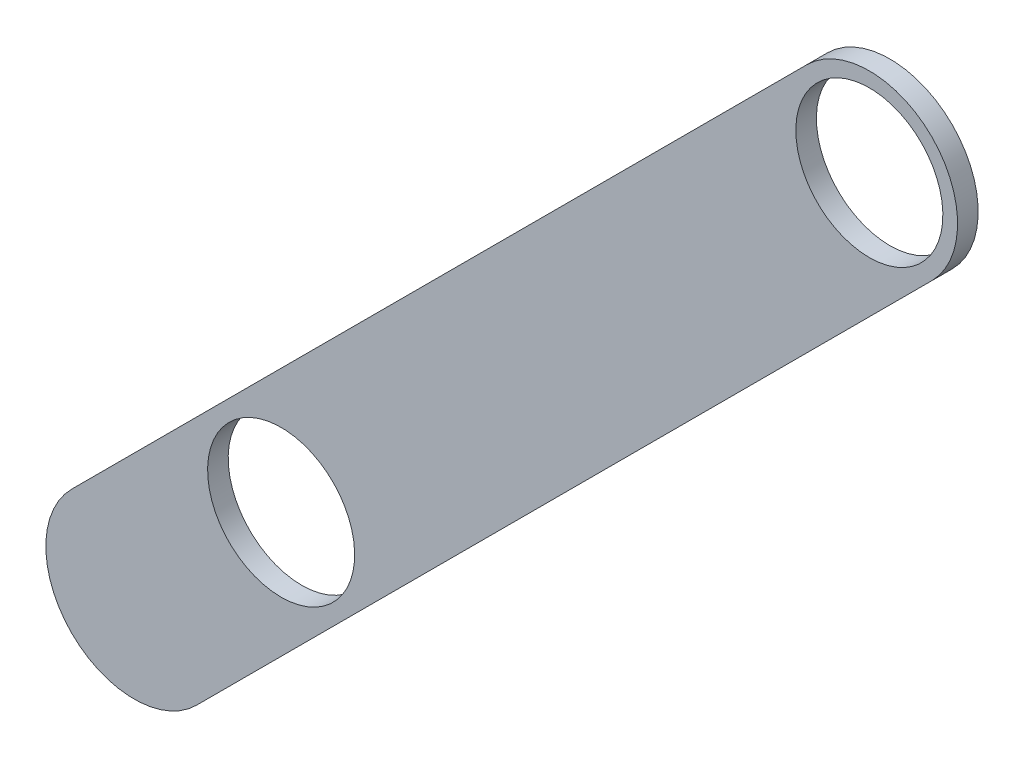
ISO-10303-21;
HEADER;
FILE_DESCRIPTION(('STEP AP214'),'2;1');
FILE_NAME('part.step','',(''),(''),'','','');
FILE_SCHEMA(('AUTOMOTIVE_DESIGN { 1 0 10303 214 1 1 1 1 }'));
ENDSEC;
DATA;
#1=APPLICATION_CONTEXT('core data for automotive mechanical design processes');
#2=APPLICATION_PROTOCOL_DEFINITION('international standard','automotive_design',2000,#1);
#3=PRODUCT_CONTEXT('',#1,'mechanical');
#4=PRODUCT('Part','Part','',(#3));
#5=PRODUCT_RELATED_PRODUCT_CATEGORY('part','',(#4));
#6=PRODUCT_DEFINITION_FORMATION('','',#4);
#7=PRODUCT_DEFINITION_CONTEXT('part definition',#1,'design');
#8=PRODUCT_DEFINITION('design','',#6,#7);
#9=PRODUCT_DEFINITION_SHAPE('','',#8);
#10=(LENGTH_UNIT() NAMED_UNIT(*) SI_UNIT(.MILLI.,.METRE.));
#11=(NAMED_UNIT(*) PLANE_ANGLE_UNIT() SI_UNIT($,.RADIAN.));
#12=(NAMED_UNIT(*) SI_UNIT($,.STERADIAN.) SOLID_ANGLE_UNIT());
#13=UNCERTAINTY_MEASURE_WITH_UNIT(LENGTH_MEASURE(1.E-05),#10,'distance_accuracy_value','');
#14=(GEOMETRIC_REPRESENTATION_CONTEXT(3) GLOBAL_UNCERTAINTY_ASSIGNED_CONTEXT((#13)) GLOBAL_UNIT_ASSIGNED_CONTEXT((#10,
#11,#12)) REPRESENTATION_CONTEXT('',''));
#15=CARTESIAN_POINT('',(0.,0.,0.));
#16=DIRECTION('',(0.,0.,1.));
#17=DIRECTION('',(1.,0.,0.));
#18=AXIS2_PLACEMENT_3D('',#15,#16,#17);
#19=CARTESIAN_POINT('',(131.418,-116.304,-0.045));
#20=DIRECTION('',(0.,0.,-1.));
#21=DIRECTION('',(0.,-1.,0.));
#22=AXIS2_PLACEMENT_3D('',#19,#20,#21);
#23=CYLINDRICAL_SURFACE('',#22,0.125);
#24=CARTESIAN_POINT('',(131.418,-116.304,1.6));
#25=DIRECTION('',(0.,0.,-1.));
#26=DIRECTION('',(0.,-1.,0.));
#27=AXIS2_PLACEMENT_3D('',#24,#25,#26);
#28=CIRCLE('',#27,0.125);
#29=CARTESIAN_POINT('',(131.418,-116.429,1.6));
#30=VERTEX_POINT('',#29);
#31=EDGE_CURVE('E128',#30,#30,#28,.T.);
#32=ORIENTED_EDGE('',*,*,#31,.T.);
#33=DIRECTION('',(0.,0.,1.));
#34=VECTOR('',#33,1.);
#35=CARTESIAN_POINT('',(131.418,-116.429,-0.045));
#36=LINE('',#35,#34);
#37=CARTESIAN_POINT('',(131.418,-116.429,1.635));
#38=VERTEX_POINT('',#37);
#39=EDGE_CURVE('E11',#30,#38,#36,.T.);
#40=ORIENTED_EDGE('',*,*,#39,.T.);
#41=CARTESIAN_POINT('',(131.418,-116.304,1.635));
#42=DIRECTION('',(0.,0.,-1.));
#43=DIRECTION('',(0.,-1.,0.));
#44=AXIS2_PLACEMENT_3D('',#41,#42,#43);
#45=CIRCLE('',#44,0.125);
#46=EDGE_CURVE('E132',#38,#38,#45,.T.);
#47=ORIENTED_EDGE('',*,*,#46,.F.);
#48=ORIENTED_EDGE('',*,*,#39,.F.);
#49=EDGE_LOOP('',(#32,#40,#47,#48));
#50=FACE_BOUND('',#49,.T.);
#51=ADVANCED_FACE('F17',(#50),#23,.F.);
#52=CARTESIAN_POINT('',(130.418,-117.304,-0.045));
#53=DIRECTION('',(0.,0.,-1.));
#54=DIRECTION('',(0.,-1.,0.));
#55=AXIS2_PLACEMENT_3D('',#52,#53,#54);
#56=CYLINDRICAL_SURFACE('',#55,0.125);
#57=CARTESIAN_POINT('',(130.418,-117.304,1.6));
#58=DIRECTION('',(0.,0.,-1.));
#59=DIRECTION('',(0.,-1.,0.));
#60=AXIS2_PLACEMENT_3D('',#57,#58,#59);
#61=CIRCLE('',#60,0.125);
#62=CARTESIAN_POINT('',(130.418,-117.429,1.6));
#63=VERTEX_POINT('',#62);
#64=EDGE_CURVE('E138',#63,#63,#61,.T.);
#65=ORIENTED_EDGE('',*,*,#64,.T.);
#66=DIRECTION('',(0.,0.,1.));
#67=VECTOR('',#66,1.);
#68=CARTESIAN_POINT('',(130.418,-117.429,-0.045));
#69=LINE('',#68,#67);
#70=CARTESIAN_POINT('',(130.418,-117.429,1.635));
#71=VERTEX_POINT('',#70);
#72=EDGE_CURVE('E26',#63,#71,#69,.T.);
#73=ORIENTED_EDGE('',*,*,#72,.T.);
#74=CARTESIAN_POINT('',(130.418,-117.304,1.635));
#75=DIRECTION('',(0.,0.,-1.));
#76=DIRECTION('',(0.,-1.,0.));
#77=AXIS2_PLACEMENT_3D('',#74,#75,#76);
#78=CIRCLE('',#77,0.125);
#79=EDGE_CURVE('E127',#71,#71,#78,.T.);
#80=ORIENTED_EDGE('',*,*,#79,.F.);
#81=ORIENTED_EDGE('',*,*,#72,.F.);
#82=EDGE_LOOP('',(#65,#73,#80,#81));
#83=FACE_BOUND('',#82,.T.);
#84=ADVANCED_FACE('F170',(#83),#56,.F.);
#85=CARTESIAN_POINT('',(131.311933,-116.197933,1.6));
#86=DIRECTION('',(0.707106781186548,-0.707106781186548,0.));
#87=DIRECTION('',(0.,0.,-1.));
#88=AXIS2_PLACEMENT_3D('',#85,#86,#87);
#89=PLANE('',#88);
#90=DIRECTION('',(-0.707106781186548,-0.707106781186548,0.));
#91=VECTOR('',#90,1.);
#92=CARTESIAN_POINT('',(131.311933,-116.197933,1.6));
#93=LINE('',#92,#91);
#94=CARTESIAN_POINT('',(131.311933,-116.197933,1.6));
#95=VERTEX_POINT('',#94);
#96=CARTESIAN_POINT('',(130.061933,-117.447933,1.6));
#97=VERTEX_POINT('',#96);
#98=EDGE_CURVE('E141',#95,#97,#93,.T.);
#99=ORIENTED_EDGE('',*,*,#98,.T.);
#100=DIRECTION('',(0.,0.,1.));
#101=VECTOR('',#100,1.);
#102=CARTESIAN_POINT('',(130.061933,-117.447933,1.6));
#103=LINE('',#102,#101);
#104=CARTESIAN_POINT('',(130.061933,-117.447933,1.635));
#105=VERTEX_POINT('',#104);
#106=EDGE_CURVE('E96',#97,#105,#103,.T.);
#107=ORIENTED_EDGE('',*,*,#106,.T.);
#108=DIRECTION('',(-0.707106781186548,-0.707106781186548,0.));
#109=VECTOR('',#108,1.);
#110=CARTESIAN_POINT('',(131.311933,-116.197933,1.635));
#111=LINE('',#110,#109);
#112=CARTESIAN_POINT('',(131.311933,-116.197933,1.635));
#113=VERTEX_POINT('',#112);
#114=EDGE_CURVE('E124',#113,#105,#111,.T.);
#115=ORIENTED_EDGE('',*,*,#114,.F.);
#116=DIRECTION('',(0.,0.,1.));
#117=VECTOR('',#116,1.);
#118=CARTESIAN_POINT('',(131.311933,-116.197933,1.6));
#119=LINE('',#118,#117);
#120=EDGE_CURVE('E150',#95,#113,#119,.T.);
#121=ORIENTED_EDGE('',*,*,#120,.F.);
#122=EDGE_LOOP('',(#99,#107,#115,#121));
#123=FACE_BOUND('',#122,.T.);
#124=ADVANCED_FACE('F19',(#123),#89,.F.);
#125=CARTESIAN_POINT('',(130.274066,-117.660066,1.635));
#126=DIRECTION('',(0.,0.,1.));
#127=DIRECTION('',(1.,0.,0.));
#128=AXIS2_PLACEMENT_3D('',#125,#126,#127);
#129=PLANE('',#128);
#130=ORIENTED_EDGE('',*,*,#46,.T.);
#131=EDGE_LOOP('',(#130));
#132=FACE_BOUND('',#131,.T.);
#133=ORIENTED_EDGE('',*,*,#79,.T.);
#134=EDGE_LOOP('',(#133));
#135=FACE_BOUND('',#134,.T.);
#136=DIRECTION('',(0.707106781186548,0.707106781186548,0.));
#137=VECTOR('',#136,1.);
#138=CARTESIAN_POINT('',(130.274066,-117.660066,1.635));
#139=LINE('',#138,#137);
#140=CARTESIAN_POINT('',(130.274066,-117.660066,1.635));
#141=VERTEX_POINT('',#140);
#142=CARTESIAN_POINT('',(131.524066,-116.410066,1.635));
#143=VERTEX_POINT('',#142);
#144=EDGE_CURVE('E108',#141,#143,#139,.T.);
#145=ORIENTED_EDGE('',*,*,#144,.T.);
#146=CARTESIAN_POINT('',(131.4179995,-116.3039995,1.635));
#147=DIRECTION('',(0.,0.,1.));
#148=DIRECTION('',(0.707106781186548,-0.707106781186548,0.));
#149=AXIS2_PLACEMENT_3D('',#146,#147,#148);
#150=CIRCLE('',#149,0.150000682813);
#151=EDGE_CURVE('E146',#143,#113,#150,.T.);
#152=ORIENTED_EDGE('',*,*,#151,.T.);
#153=ORIENTED_EDGE('',*,*,#114,.T.);
#154=CARTESIAN_POINT('',(130.1679995,-117.5539995,1.635));
#155=DIRECTION('',(0.,0.,1.));
#156=DIRECTION('',(-0.707106781186548,0.707106781186548,0.));
#157=AXIS2_PLACEMENT_3D('',#154,#155,#156);
#158=CIRCLE('',#157,0.150000682813);
#159=EDGE_CURVE('E100',#105,#141,#158,.T.);
#160=ORIENTED_EDGE('',*,*,#159,.T.);
#161=EDGE_LOOP('',(#145,#152,#153,#160));
#162=FACE_BOUND('',#161,.T.);
#163=ADVANCED_FACE('F161',(#132,#135,#162),#129,.T.);
#164=CARTESIAN_POINT('',(130.274066,-117.660066,1.6));
#165=DIRECTION('',(0.,0.,1.));
#166=DIRECTION('',(1.,0.,0.));
#167=AXIS2_PLACEMENT_3D('',#164,#165,#166);
#168=PLANE('',#167);
#169=ORIENTED_EDGE('',*,*,#31,.F.);
#170=EDGE_LOOP('',(#169));
#171=FACE_BOUND('',#170,.T.);
#172=ORIENTED_EDGE('',*,*,#64,.F.);
#173=EDGE_LOOP('',(#172));
#174=FACE_BOUND('',#173,.T.);
#175=CARTESIAN_POINT('',(130.1679995,-117.5539995,1.6));
#176=DIRECTION('',(0.,0.,1.));
#177=DIRECTION('',(-0.707106781186548,0.707106781186548,0.));
#178=AXIS2_PLACEMENT_3D('',#175,#176,#177);
#179=CIRCLE('',#178,0.150000682813);
#180=CARTESIAN_POINT('',(130.274066,-117.660066,1.6));
#181=VERTEX_POINT('',#180);
#182=EDGE_CURVE('E89',#97,#181,#179,.T.);
#183=ORIENTED_EDGE('',*,*,#182,.F.);
#184=ORIENTED_EDGE('',*,*,#98,.F.);
#185=CARTESIAN_POINT('',(131.4179995,-116.3039995,1.6));
#186=DIRECTION('',(0.,0.,1.));
#187=DIRECTION('',(0.707106781186548,-0.707106781186548,0.));
#188=AXIS2_PLACEMENT_3D('',#185,#186,#187);
#189=CIRCLE('',#188,0.150000682813);
#190=CARTESIAN_POINT('',(131.524066,-116.410066,1.6));
#191=VERTEX_POINT('',#190);
#192=EDGE_CURVE('E113',#191,#95,#189,.T.);
#193=ORIENTED_EDGE('',*,*,#192,.F.);
#194=DIRECTION('',(0.707106781186548,0.707106781186548,0.));
#195=VECTOR('',#194,1.);
#196=CARTESIAN_POINT('',(130.274066,-117.660066,1.6));
#197=LINE('',#196,#195);
#198=EDGE_CURVE('E106',#181,#191,#197,.T.);
#199=ORIENTED_EDGE('',*,*,#198,.F.);
#200=EDGE_LOOP('',(#183,#184,#193,#199));
#201=FACE_BOUND('',#200,.T.);
#202=ADVANCED_FACE('F111',(#171,#174,#201),#168,.F.);
#203=CARTESIAN_POINT('',(131.4179995,-116.3039995,1.6));
#204=DIRECTION('',(0.,0.,-1.));
#205=DIRECTION('',(0.707106781186548,-0.707106781186548,0.));
#206=AXIS2_PLACEMENT_3D('',#203,#204,#205);
#207=CYLINDRICAL_SURFACE('',#206,0.150000682813);
#208=ORIENTED_EDGE('',*,*,#192,.T.);
#209=ORIENTED_EDGE('',*,*,#120,.T.);
#210=ORIENTED_EDGE('',*,*,#151,.F.);
#211=DIRECTION('',(0.,0.,1.));
#212=VECTOR('',#211,1.);
#213=CARTESIAN_POINT('',(131.524066,-116.410066,1.6));
#214=LINE('',#213,#212);
#215=EDGE_CURVE('E116',#191,#143,#214,.T.);
#216=ORIENTED_EDGE('',*,*,#215,.F.);
#217=EDGE_LOOP('',(#208,#209,#210,#216));
#218=FACE_BOUND('',#217,.T.);
#219=ADVANCED_FACE('F167',(#218),#207,.T.);
#220=CARTESIAN_POINT('',(130.1679995,-117.5539995,1.6));
#221=DIRECTION('',(0.,0.,-1.));
#222=DIRECTION('',(-0.707106781186548,0.707106781186548,0.));
#223=AXIS2_PLACEMENT_3D('',#220,#221,#222);
#224=CYLINDRICAL_SURFACE('',#223,0.150000682813);
#225=ORIENTED_EDGE('',*,*,#182,.T.);
#226=DIRECTION('',(0.,0.,1.));
#227=VECTOR('',#226,1.);
#228=CARTESIAN_POINT('',(130.274066,-117.660066,1.6));
#229=LINE('',#228,#227);
#230=EDGE_CURVE('E93',#181,#141,#229,.T.);
#231=ORIENTED_EDGE('',*,*,#230,.T.);
#232=ORIENTED_EDGE('',*,*,#159,.F.);
#233=ORIENTED_EDGE('',*,*,#106,.F.);
#234=EDGE_LOOP('',(#225,#231,#232,#233));
#235=FACE_BOUND('',#234,.T.);
#236=ADVANCED_FACE('F91',(#235),#224,.T.);
#237=CARTESIAN_POINT('',(130.274066,-117.660066,1.6));
#238=DIRECTION('',(-0.707106781186548,0.707106781186548,0.));
#239=DIRECTION('',(0.,0.,1.));
#240=AXIS2_PLACEMENT_3D('',#237,#238,#239);
#241=PLANE('',#240);
#242=ORIENTED_EDGE('',*,*,#198,.T.);
#243=ORIENTED_EDGE('',*,*,#215,.T.);
#244=ORIENTED_EDGE('',*,*,#144,.F.);
#245=ORIENTED_EDGE('',*,*,#230,.F.);
#246=EDGE_LOOP('',(#242,#243,#244,#245));
#247=FACE_BOUND('',#246,.T.);
#248=ADVANCED_FACE('F104',(#247),#241,.F.);
#249=CLOSED_SHELL('',(#51,#84,#124,#163,#202,#219,#236,#248));
#250=MANIFOLD_SOLID_BREP('B1',#249);
#251=ADVANCED_BREP_SHAPE_REPRESENTATION('',(#18,#250),#14);
#252=SHAPE_DEFINITION_REPRESENTATION(#9,#251);
ENDSEC;
END-ISO-10303-21;
